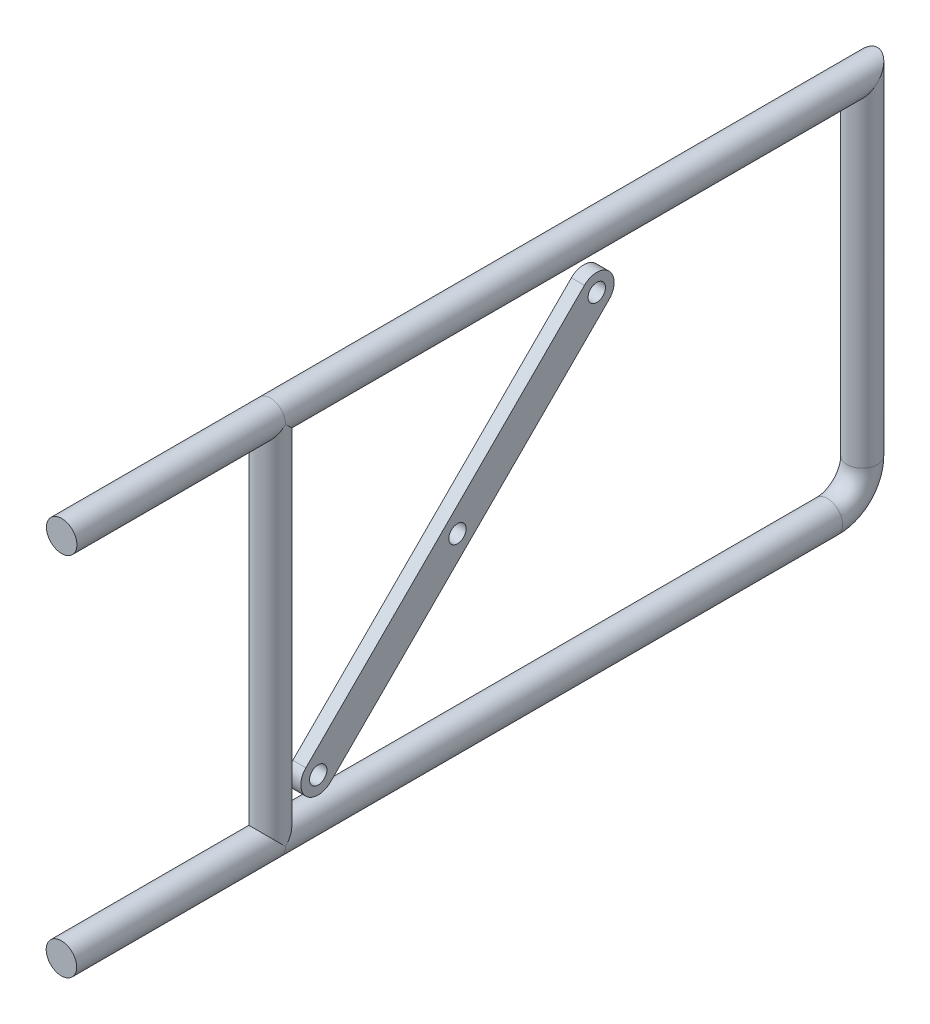
ISO-10303-21;
HEADER;
FILE_DESCRIPTION(('STEP AP214'),'2;1');
FILE_NAME('part.step','',(''),(''),'','','');
FILE_SCHEMA(('AUTOMOTIVE_DESIGN { 1 0 10303 214 1 1 1 1 }'));
ENDSEC;
DATA;
#1=APPLICATION_CONTEXT('core data for automotive mechanical design processes');
#2=APPLICATION_PROTOCOL_DEFINITION('international standard','automotive_design',2000,#1);
#3=PRODUCT_CONTEXT('',#1,'mechanical');
#4=PRODUCT('Part','Part','',(#3));
#5=PRODUCT_RELATED_PRODUCT_CATEGORY('part','',(#4));
#6=PRODUCT_DEFINITION_FORMATION('','',#4);
#7=PRODUCT_DEFINITION_CONTEXT('part definition',#1,'design');
#8=PRODUCT_DEFINITION('design','',#6,#7);
#9=PRODUCT_DEFINITION_SHAPE('','',#8);
#10=(LENGTH_UNIT() NAMED_UNIT(*) SI_UNIT(.MILLI.,.METRE.));
#11=(NAMED_UNIT(*) PLANE_ANGLE_UNIT() SI_UNIT($,.RADIAN.));
#12=(NAMED_UNIT(*) SI_UNIT($,.STERADIAN.) SOLID_ANGLE_UNIT());
#13=UNCERTAINTY_MEASURE_WITH_UNIT(LENGTH_MEASURE(1.E-05),#10,'distance_accuracy_value','');
#14=(GEOMETRIC_REPRESENTATION_CONTEXT(3) GLOBAL_UNCERTAINTY_ASSIGNED_CONTEXT((#13)) GLOBAL_UNIT_ASSIGNED_CONTEXT((#10,
#11,#12)) REPRESENTATION_CONTEXT('',''));
#15=CARTESIAN_POINT('',(0.,0.,0.));
#16=DIRECTION('',(0.,0.,1.));
#17=DIRECTION('',(1.,0.,0.));
#18=AXIS2_PLACEMENT_3D('',#15,#16,#17);
#19=CARTESIAN_POINT('',(9.525,-463.55,-380.81277953915));
#20=DIRECTION('',(1.,0.,0.));
#21=DIRECTION('',(0.,0.,-1.));
#22=AXIS2_PLACEMENT_3D('',#19,#20,#21);
#23=PLANE('',#22);
#24=CARTESIAN_POINT('',(9.525,-565.15,-279.212779539151));
#25=DIRECTION('',(1.,0.,0.));
#26=DIRECTION('',(0.,0.,-1.));
#27=AXIS2_PLACEMENT_3D('',#24,#25,#26);
#28=CIRCLE('',#27,6.34999999999999);
#29=CARTESIAN_POINT('',(9.525,-565.15,-272.86277953915));
#30=VERTEX_POINT('',#29);
#31=EDGE_CURVE('E175',#30,#30,#28,.T.);
#32=ORIENTED_EDGE('',*,*,#31,.F.);
#33=EDGE_LOOP('',(#32));
#34=FACE_BOUND('',#33,.T.);
#35=CARTESIAN_POINT('',(9.525,-463.55,-380.81277953915));
#36=DIRECTION('',(1.,0.,0.));
#37=DIRECTION('',(0.,0.,-1.));
#38=AXIS2_PLACEMENT_3D('',#35,#36,#37);
#39=CIRCLE('',#38,12.6999999999999);
#40=CARTESIAN_POINT('',(9.525,-472.530256121069,-389.793035660219));
#41=VERTEX_POINT('',#40);
#42=CARTESIAN_POINT('',(9.525,-454.569743878931,-371.832523418081));
#43=VERTEX_POINT('',#42);
#44=EDGE_CURVE('E146',#41,#43,#39,.T.);
#45=ORIENTED_EDGE('',*,*,#44,.T.);
#46=DIRECTION('',(0.,-0.707106781186549,0.707106781186546));
#47=VECTOR('',#46,1.);
#48=CARTESIAN_POINT('',(9.525,-454.569743878931,-371.832523418081));
#49=LINE('',#48,#47);
#50=CARTESIAN_POINT('',(9.525,-657.769743878931,-168.632523418082));
#51=VERTEX_POINT('',#50);
#52=EDGE_CURVE('E139',#43,#51,#49,.T.);
#53=ORIENTED_EDGE('',*,*,#52,.T.);
#54=CARTESIAN_POINT('',(9.525,-666.75,-177.612779539151));
#55=DIRECTION('',(1.,0.,0.));
#56=DIRECTION('',(0.,0.,-1.));
#57=AXIS2_PLACEMENT_3D('',#54,#55,#56);
#58=CIRCLE('',#57,12.6999999999999);
#59=CARTESIAN_POINT('',(9.525,-675.730256121069,-186.59303566022));
#60=VERTEX_POINT('',#59);
#61=EDGE_CURVE('E145',#51,#60,#58,.T.);
#62=ORIENTED_EDGE('',*,*,#61,.T.);
#63=DIRECTION('',(0.,-0.707106781186549,0.707106781186546));
#64=VECTOR('',#63,1.);
#65=CARTESIAN_POINT('',(9.525,-472.530256121069,-389.793035660219));
#66=LINE('',#65,#64);
#67=EDGE_CURVE('E155',#41,#60,#66,.T.);
#68=ORIENTED_EDGE('',*,*,#67,.F.);
#69=EDGE_LOOP('',(#45,#53,#62,#68));
#70=FACE_BOUND('',#69,.T.);
#71=CARTESIAN_POINT('',(9.525,-463.55,-380.81277953915));
#72=DIRECTION('',(1.,0.,0.));
#73=DIRECTION('',(0.,0.,-1.));
#74=AXIS2_PLACEMENT_3D('',#71,#72,#73);
#75=CIRCLE('',#74,6.34999999999999);
#76=CARTESIAN_POINT('',(9.525,-463.55,-374.46277953915));
#77=VERTEX_POINT('',#76);
#78=EDGE_CURVE('E162',#77,#77,#75,.T.);
#79=ORIENTED_EDGE('',*,*,#78,.F.);
#80=EDGE_LOOP('',(#79));
#81=FACE_BOUND('',#80,.T.);
#82=CARTESIAN_POINT('',(9.525,-666.75,-177.612779539151));
#83=DIRECTION('',(1.,0.,0.));
#84=DIRECTION('',(0.,0.,-1.));
#85=AXIS2_PLACEMENT_3D('',#82,#83,#84);
#86=CIRCLE('',#85,6.34999999999999);
#87=CARTESIAN_POINT('',(9.525,-666.75,-171.262779539151));
#88=VERTEX_POINT('',#87);
#89=EDGE_CURVE('E181',#88,#88,#86,.T.);
#90=ORIENTED_EDGE('',*,*,#89,.F.);
#91=EDGE_LOOP('',(#90));
#92=FACE_BOUND('',#91,.T.);
#93=ADVANCED_FACE('F96',(#34,#70,#81,#92),#23,.T.);
#94=CARTESIAN_POINT('',(0.,-463.55,-380.81277953915));
#95=DIRECTION('',(1.,0.,0.));
#96=DIRECTION('',(0.,0.,-1.));
#97=AXIS2_PLACEMENT_3D('',#94,#95,#96);
#98=PLANE('',#97);
#99=CARTESIAN_POINT('',(0.,-463.55,-380.81277953915));
#100=DIRECTION('',(1.,0.,0.));
#101=DIRECTION('',(0.,0.,-1.));
#102=AXIS2_PLACEMENT_3D('',#99,#100,#101);
#103=CIRCLE('',#102,12.6999999999999);
#104=CARTESIAN_POINT('',(0.,-472.530256121069,-389.793035660219));
#105=VERTEX_POINT('',#104);
#106=CARTESIAN_POINT('',(0.,-454.569743878931,-371.832523418081));
#107=VERTEX_POINT('',#106);
#108=EDGE_CURVE('E160',#105,#107,#103,.T.);
#109=ORIENTED_EDGE('',*,*,#108,.F.);
#110=DIRECTION('',(0.,-0.707106781186549,0.707106781186546));
#111=VECTOR('',#110,1.);
#112=CARTESIAN_POINT('',(0.,-472.530256121069,-389.793035660219));
#113=LINE('',#112,#111);
#114=CARTESIAN_POINT('',(0.,-675.730256121069,-186.59303566022));
#115=VERTEX_POINT('',#114);
#116=EDGE_CURVE('E166',#105,#115,#113,.T.);
#117=ORIENTED_EDGE('',*,*,#116,.T.);
#118=CARTESIAN_POINT('',(0.,-666.75,-177.612779539151));
#119=DIRECTION('',(1.,0.,0.));
#120=DIRECTION('',(0.,0.,-1.));
#121=AXIS2_PLACEMENT_3D('',#118,#119,#120);
#122=CIRCLE('',#121,12.6999999999999);
#123=CARTESIAN_POINT('',(0.,-657.769743878931,-168.632523418082));
#124=VERTEX_POINT('',#123);
#125=EDGE_CURVE('E164',#124,#115,#122,.T.);
#126=ORIENTED_EDGE('',*,*,#125,.F.);
#127=DIRECTION('',(0.,-0.707106781186549,0.707106781186546));
#128=VECTOR('',#127,1.);
#129=CARTESIAN_POINT('',(0.,-454.569743878931,-371.832523418081));
#130=LINE('',#129,#128);
#131=EDGE_CURVE('E151',#107,#124,#130,.T.);
#132=ORIENTED_EDGE('',*,*,#131,.F.);
#133=EDGE_LOOP('',(#109,#117,#126,#132));
#134=FACE_BOUND('',#133,.T.);
#135=CARTESIAN_POINT('',(0.,-463.55,-380.81277953915));
#136=DIRECTION('',(1.,0.,0.));
#137=DIRECTION('',(0.,0.,-1.));
#138=AXIS2_PLACEMENT_3D('',#135,#136,#137);
#139=CIRCLE('',#138,6.34999999999999);
#140=CARTESIAN_POINT('',(0.,-463.55,-374.46277953915));
#141=VERTEX_POINT('',#140);
#142=EDGE_CURVE('E172',#141,#141,#139,.T.);
#143=ORIENTED_EDGE('',*,*,#142,.T.);
#144=EDGE_LOOP('',(#143));
#145=FACE_BOUND('',#144,.T.);
#146=CARTESIAN_POINT('',(0.,-565.15,-279.212779539151));
#147=DIRECTION('',(1.,0.,0.));
#148=DIRECTION('',(0.,0.,-1.));
#149=AXIS2_PLACEMENT_3D('',#146,#147,#148);
#150=CIRCLE('',#149,6.34999999999999);
#151=CARTESIAN_POINT('',(0.,-565.15,-272.86277953915));
#152=VERTEX_POINT('',#151);
#153=EDGE_CURVE('E178',#152,#152,#150,.T.);
#154=ORIENTED_EDGE('',*,*,#153,.T.);
#155=EDGE_LOOP('',(#154));
#156=FACE_BOUND('',#155,.T.);
#157=CARTESIAN_POINT('',(0.,-666.75,-177.612779539151));
#158=DIRECTION('',(1.,0.,0.));
#159=DIRECTION('',(0.,0.,-1.));
#160=AXIS2_PLACEMENT_3D('',#157,#158,#159);
#161=CIRCLE('',#160,6.34999999999999);
#162=CARTESIAN_POINT('',(0.,-666.75,-171.262779539151));
#163=VERTEX_POINT('',#162);
#164=EDGE_CURVE('E184',#163,#163,#161,.T.);
#165=ORIENTED_EDGE('',*,*,#164,.T.);
#166=EDGE_LOOP('',(#165));
#167=FACE_BOUND('',#166,.T.);
#168=ADVANCED_FACE('F194',(#134,#145,#156,#167),#98,.F.);
#169=CARTESIAN_POINT('',(9.525,-463.55,-380.81277953915));
#170=DIRECTION('',(-1.,0.,0.));
#171=DIRECTION('',(0.,0.,1.));
#172=AXIS2_PLACEMENT_3D('',#169,#170,#171);
#173=CYLINDRICAL_SURFACE('',#172,12.6999999999999);
#174=ORIENTED_EDGE('',*,*,#108,.T.);
#175=DIRECTION('',(-1.,0.,0.));
#176=VECTOR('',#175,1.);
#177=CARTESIAN_POINT('',(9.525,-454.569743878931,-371.832523418081));
#178=LINE('',#177,#176);
#179=EDGE_CURVE('E13',#43,#107,#178,.T.);
#180=ORIENTED_EDGE('',*,*,#179,.F.);
#181=ORIENTED_EDGE('',*,*,#44,.F.);
#182=DIRECTION('',(-1.,0.,0.));
#183=VECTOR('',#182,1.);
#184=CARTESIAN_POINT('',(9.525,-472.530256121069,-389.793035660219));
#185=LINE('',#184,#183);
#186=EDGE_CURVE('E113',#41,#105,#185,.T.);
#187=ORIENTED_EDGE('',*,*,#186,.T.);
#188=EDGE_LOOP('',(#174,#180,#181,#187));
#189=FACE_BOUND('',#188,.T.);
#190=ADVANCED_FACE('F98',(#189),#173,.T.);
#191=CARTESIAN_POINT('',(9.525,-454.569743878931,-371.832523418081));
#192=DIRECTION('',(0.,-0.707106781186546,-0.707106781186549));
#193=DIRECTION('',(0.,0.707106781186549,-0.707106781186546));
#194=AXIS2_PLACEMENT_3D('',#191,#192,#193);
#195=PLANE('',#194);
#196=ORIENTED_EDGE('',*,*,#131,.T.);
#197=DIRECTION('',(-1.,0.,0.));
#198=VECTOR('',#197,1.);
#199=CARTESIAN_POINT('',(9.525,-657.769743878931,-168.632523418082));
#200=LINE('',#199,#198);
#201=EDGE_CURVE('E105',#51,#124,#200,.T.);
#202=ORIENTED_EDGE('',*,*,#201,.F.);
#203=ORIENTED_EDGE('',*,*,#52,.F.);
#204=ORIENTED_EDGE('',*,*,#179,.T.);
#205=EDGE_LOOP('',(#196,#202,#203,#204));
#206=FACE_BOUND('',#205,.T.);
#207=ADVANCED_FACE('F150',(#206),#195,.F.);
#208=CARTESIAN_POINT('',(9.525,-666.75,-177.612779539151));
#209=DIRECTION('',(-1.,0.,0.));
#210=DIRECTION('',(0.,0.,1.));
#211=AXIS2_PLACEMENT_3D('',#208,#209,#210);
#212=CYLINDRICAL_SURFACE('',#211,12.6999999999999);
#213=ORIENTED_EDGE('',*,*,#125,.T.);
#214=DIRECTION('',(-1.,0.,0.));
#215=VECTOR('',#214,1.);
#216=CARTESIAN_POINT('',(9.525,-675.730256121069,-186.59303566022));
#217=LINE('',#216,#215);
#218=EDGE_CURVE('E128',#60,#115,#217,.T.);
#219=ORIENTED_EDGE('',*,*,#218,.F.);
#220=ORIENTED_EDGE('',*,*,#61,.F.);
#221=ORIENTED_EDGE('',*,*,#201,.T.);
#222=EDGE_LOOP('',(#213,#219,#220,#221));
#223=FACE_BOUND('',#222,.T.);
#224=ADVANCED_FACE('F154',(#223),#212,.T.);
#225=CARTESIAN_POINT('',(9.525,-472.530256121069,-389.793035660219));
#226=DIRECTION('',(0.,-0.707106781186546,-0.707106781186549));
#227=DIRECTION('',(0.,0.707106781186549,-0.707106781186546));
#228=AXIS2_PLACEMENT_3D('',#225,#226,#227);
#229=PLANE('',#228);
#230=ORIENTED_EDGE('',*,*,#116,.F.);
#231=ORIENTED_EDGE('',*,*,#186,.F.);
#232=ORIENTED_EDGE('',*,*,#67,.T.);
#233=ORIENTED_EDGE('',*,*,#218,.T.);
#234=EDGE_LOOP('',(#230,#231,#232,#233));
#235=FACE_BOUND('',#234,.T.);
#236=ADVANCED_FACE('F206',(#235),#229,.T.);
#237=CARTESIAN_POINT('',(9.525,-463.55,-380.81277953915));
#238=DIRECTION('',(-1.,0.,0.));
#239=DIRECTION('',(0.,0.,1.));
#240=AXIS2_PLACEMENT_3D('',#237,#238,#239);
#241=CYLINDRICAL_SURFACE('',#240,6.34999999999999);
#242=CARTESIAN_POINT('',(9.525,-463.55,-374.46277953915));
#243=CARTESIAN_POINT('',(9.42578125,-463.55,-374.46277953915));
#244=CARTESIAN_POINT('',(9.3265625,-463.55,-374.46277953915));
#245=CARTESIAN_POINT('',(9.128125,-463.55,-374.46277953915));
#246=CARTESIAN_POINT('',(9.02890625,-463.55,-374.46277953915));
#247=CARTESIAN_POINT('',(8.83046875,-463.55,-374.46277953915));
#248=CARTESIAN_POINT('',(8.73125,-463.55,-374.46277953915));
#249=CARTESIAN_POINT('',(8.5328125,-463.55,-374.46277953915));
#250=CARTESIAN_POINT('',(8.43359375,-463.55,-374.46277953915));
#251=CARTESIAN_POINT('',(8.23515625,-463.55,-374.46277953915));
#252=CARTESIAN_POINT('',(8.1359375,-463.55,-374.46277953915));
#253=CARTESIAN_POINT('',(7.9375,-463.55,-374.46277953915));
#254=CARTESIAN_POINT('',(7.83828125,-463.55,-374.46277953915));
#255=CARTESIAN_POINT('',(7.63984375,-463.55,-374.46277953915));
#256=CARTESIAN_POINT('',(7.540625,-463.55,-374.46277953915));
#257=CARTESIAN_POINT('',(7.3421875,-463.55,-374.46277953915));
#258=CARTESIAN_POINT('',(7.24296875,-463.55,-374.46277953915));
#259=CARTESIAN_POINT('',(7.04453125,-463.55,-374.46277953915));
#260=CARTESIAN_POINT('',(6.9453125,-463.55,-374.46277953915));
#261=CARTESIAN_POINT('',(6.746875,-463.55,-374.46277953915));
#262=CARTESIAN_POINT('',(6.64765625,-463.55,-374.46277953915));
#263=CARTESIAN_POINT('',(6.44921875,-463.55,-374.46277953915));
#264=CARTESIAN_POINT('',(6.35,-463.55,-374.46277953915));
#265=CARTESIAN_POINT('',(6.1515625,-463.55,-374.46277953915));
#266=CARTESIAN_POINT('',(6.05234375,-463.55,-374.46277953915));
#267=CARTESIAN_POINT('',(5.85390625,-463.55,-374.46277953915));
#268=CARTESIAN_POINT('',(5.7546875,-463.55,-374.46277953915));
#269=CARTESIAN_POINT('',(5.55625,-463.55,-374.46277953915));
#270=CARTESIAN_POINT('',(5.45703125,-463.55,-374.46277953915));
#271=CARTESIAN_POINT('',(5.25859375,-463.55,-374.46277953915));
#272=CARTESIAN_POINT('',(5.159375,-463.55,-374.46277953915));
#273=CARTESIAN_POINT('',(4.9609375,-463.55,-374.46277953915));
#274=CARTESIAN_POINT('',(4.86171875,-463.55,-374.46277953915));
#275=CARTESIAN_POINT('',(4.66328125,-463.55,-374.46277953915));
#276=CARTESIAN_POINT('',(4.5640625,-463.55,-374.46277953915));
#277=CARTESIAN_POINT('',(4.365625,-463.55,-374.46277953915));
#278=CARTESIAN_POINT('',(4.26640625,-463.55,-374.46277953915));
#279=CARTESIAN_POINT('',(4.06796875,-463.55,-374.46277953915));
#280=CARTESIAN_POINT('',(3.96875,-463.55,-374.46277953915));
#281=CARTESIAN_POINT('',(3.7703125,-463.55,-374.46277953915));
#282=CARTESIAN_POINT('',(3.67109375,-463.55,-374.46277953915));
#283=CARTESIAN_POINT('',(3.47265625,-463.55,-374.46277953915));
#284=CARTESIAN_POINT('',(3.3734375,-463.55,-374.46277953915));
#285=CARTESIAN_POINT('',(3.175,-463.55,-374.46277953915));
#286=CARTESIAN_POINT('',(3.07578125,-463.55,-374.46277953915));
#287=CARTESIAN_POINT('',(2.87734375,-463.55,-374.46277953915));
#288=CARTESIAN_POINT('',(2.778125,-463.55,-374.46277953915));
#289=CARTESIAN_POINT('',(2.5796875,-463.55,-374.46277953915));
#290=CARTESIAN_POINT('',(2.48046875,-463.55,-374.46277953915));
#291=CARTESIAN_POINT('',(2.28203125,-463.55,-374.46277953915));
#292=CARTESIAN_POINT('',(2.1828125,-463.55,-374.46277953915));
#293=CARTESIAN_POINT('',(1.984375,-463.55,-374.46277953915));
#294=CARTESIAN_POINT('',(1.88515625,-463.55,-374.46277953915));
#295=CARTESIAN_POINT('',(1.68671875,-463.55,-374.46277953915));
#296=CARTESIAN_POINT('',(1.5875,-463.55,-374.46277953915));
#297=CARTESIAN_POINT('',(1.3890625,-463.55,-374.46277953915));
#298=CARTESIAN_POINT('',(1.28984375,-463.55,-374.46277953915));
#299=CARTESIAN_POINT('',(1.09140625,-463.55,-374.46277953915));
#300=CARTESIAN_POINT('',(0.992187500000001,-463.55,-374.46277953915));
#301=CARTESIAN_POINT('',(0.793750000000001,-463.55,-374.46277953915));
#302=CARTESIAN_POINT('',(0.69453125,-463.55,-374.46277953915));
#303=CARTESIAN_POINT('',(0.49609375,-463.55,-374.46277953915));
#304=CARTESIAN_POINT('',(0.396875,-463.55,-374.46277953915));
#305=CARTESIAN_POINT('',(0.1984375,-463.55,-374.46277953915));
#306=CARTESIAN_POINT('',(0.0992187500000001,-463.55,-374.46277953915));
#307=CARTESIAN_POINT('',(0.,-463.55,-374.46277953915));
#308=B_SPLINE_CURVE_WITH_KNOTS('',3,(#242,#243,#244,#245,#246,#247,#248,#249,#250,#251,#252,
#253,#254,#255,#256,#257,#258,#259,#260,#261,#262,#263,#264,#265,#266,#267,#268,#269,#270,#271,
#272,#273,#274,#275,#276,#277,#278,#279,#280,#281,#282,#283,#284,#285,#286,#287,#288,#289,#290,
#291,#292,#293,#294,#295,#296,#297,#298,#299,#300,#301,#302,#303,#304,#305,#306,#307),
.UNSPECIFIED.,.F.,.F.,(4,2,2,2,2,2,2,2,2,2,2,2,2,2,2,2,2,2,2,2,2,2,2,2,2,2,2,2,2,2,2,2,4),(0.,
0.297656249999998,0.595312499999999,0.892968749999999,1.190625,1.48828125,1.7859375,2.08359375,
2.38125,2.67890625,2.9765625,3.27421875,3.571875,3.86953125,4.1671875,4.46484375,4.7625,
5.06015625,5.3578125,5.65546875,5.953125,6.25078125,6.5484375,6.84609375,7.14375,7.44140625,
7.7390625,8.03671875,8.334375,8.63203125,8.9296875,9.22734375,9.525),.UNSPECIFIED.);
#309=EDGE_CURVE('BSEAM203',#77,#141,#308,.T.);
#310=ORIENTED_EDGE('',*,*,#78,.T.);
#311=ORIENTED_EDGE('',*,*,#142,.F.);
#312=ORIENTED_EDGE('',*,*,#309,.T.);
#313=ORIENTED_EDGE('',*,*,#309,.F.);
#314=EDGE_LOOP('',(#310,#312,#311,#313));
#315=FACE_BOUND('',#314,.T.);
#316=ADVANCED_FACE('F203',(#315),#241,.F.);
#317=CARTESIAN_POINT('',(9.525,-565.15,-279.212779539151));
#318=DIRECTION('',(-1.,0.,0.));
#319=DIRECTION('',(0.,0.,1.));
#320=AXIS2_PLACEMENT_3D('',#317,#318,#319);
#321=CYLINDRICAL_SURFACE('',#320,6.34999999999999);
#322=CARTESIAN_POINT('',(9.525,-565.15,-272.86277953915));
#323=CARTESIAN_POINT('',(9.42578125,-565.15,-272.86277953915));
#324=CARTESIAN_POINT('',(9.3265625,-565.15,-272.86277953915));
#325=CARTESIAN_POINT('',(9.128125,-565.15,-272.86277953915));
#326=CARTESIAN_POINT('',(9.02890625,-565.15,-272.86277953915));
#327=CARTESIAN_POINT('',(8.83046875,-565.15,-272.86277953915));
#328=CARTESIAN_POINT('',(8.73125,-565.15,-272.86277953915));
#329=CARTESIAN_POINT('',(8.5328125,-565.15,-272.86277953915));
#330=CARTESIAN_POINT('',(8.43359375,-565.15,-272.86277953915));
#331=CARTESIAN_POINT('',(8.23515625,-565.15,-272.86277953915));
#332=CARTESIAN_POINT('',(8.1359375,-565.15,-272.86277953915));
#333=CARTESIAN_POINT('',(7.9375,-565.15,-272.86277953915));
#334=CARTESIAN_POINT('',(7.83828125,-565.15,-272.86277953915));
#335=CARTESIAN_POINT('',(7.63984375,-565.15,-272.86277953915));
#336=CARTESIAN_POINT('',(7.540625,-565.15,-272.86277953915));
#337=CARTESIAN_POINT('',(7.3421875,-565.15,-272.86277953915));
#338=CARTESIAN_POINT('',(7.24296875,-565.15,-272.86277953915));
#339=CARTESIAN_POINT('',(7.04453125,-565.15,-272.86277953915));
#340=CARTESIAN_POINT('',(6.9453125,-565.15,-272.86277953915));
#341=CARTESIAN_POINT('',(6.746875,-565.15,-272.86277953915));
#342=CARTESIAN_POINT('',(6.64765625,-565.15,-272.86277953915));
#343=CARTESIAN_POINT('',(6.44921875,-565.15,-272.86277953915));
#344=CARTESIAN_POINT('',(6.35,-565.15,-272.86277953915));
#345=CARTESIAN_POINT('',(6.1515625,-565.15,-272.86277953915));
#346=CARTESIAN_POINT('',(6.05234375,-565.15,-272.86277953915));
#347=CARTESIAN_POINT('',(5.85390625,-565.15,-272.86277953915));
#348=CARTESIAN_POINT('',(5.7546875,-565.15,-272.86277953915));
#349=CARTESIAN_POINT('',(5.55625,-565.15,-272.86277953915));
#350=CARTESIAN_POINT('',(5.45703125,-565.15,-272.86277953915));
#351=CARTESIAN_POINT('',(5.25859375,-565.15,-272.86277953915));
#352=CARTESIAN_POINT('',(5.159375,-565.15,-272.86277953915));
#353=CARTESIAN_POINT('',(4.9609375,-565.15,-272.86277953915));
#354=CARTESIAN_POINT('',(4.86171875,-565.15,-272.86277953915));
#355=CARTESIAN_POINT('',(4.66328125,-565.15,-272.86277953915));
#356=CARTESIAN_POINT('',(4.5640625,-565.15,-272.86277953915));
#357=CARTESIAN_POINT('',(4.365625,-565.15,-272.86277953915));
#358=CARTESIAN_POINT('',(4.26640625,-565.15,-272.86277953915));
#359=CARTESIAN_POINT('',(4.06796875,-565.15,-272.86277953915));
#360=CARTESIAN_POINT('',(3.96875,-565.15,-272.86277953915));
#361=CARTESIAN_POINT('',(3.7703125,-565.15,-272.86277953915));
#362=CARTESIAN_POINT('',(3.67109375,-565.15,-272.86277953915));
#363=CARTESIAN_POINT('',(3.47265625,-565.15,-272.86277953915));
#364=CARTESIAN_POINT('',(3.3734375,-565.15,-272.86277953915));
#365=CARTESIAN_POINT('',(3.175,-565.15,-272.86277953915));
#366=CARTESIAN_POINT('',(3.07578125,-565.15,-272.86277953915));
#367=CARTESIAN_POINT('',(2.87734375,-565.15,-272.86277953915));
#368=CARTESIAN_POINT('',(2.778125,-565.15,-272.86277953915));
#369=CARTESIAN_POINT('',(2.5796875,-565.15,-272.86277953915));
#370=CARTESIAN_POINT('',(2.48046875,-565.15,-272.86277953915));
#371=CARTESIAN_POINT('',(2.28203125,-565.15,-272.86277953915));
#372=CARTESIAN_POINT('',(2.1828125,-565.15,-272.86277953915));
#373=CARTESIAN_POINT('',(1.984375,-565.15,-272.86277953915));
#374=CARTESIAN_POINT('',(1.88515625,-565.15,-272.86277953915));
#375=CARTESIAN_POINT('',(1.68671875,-565.15,-272.86277953915));
#376=CARTESIAN_POINT('',(1.5875,-565.15,-272.86277953915));
#377=CARTESIAN_POINT('',(1.3890625,-565.15,-272.86277953915));
#378=CARTESIAN_POINT('',(1.28984375,-565.15,-272.86277953915));
#379=CARTESIAN_POINT('',(1.09140625,-565.15,-272.86277953915));
#380=CARTESIAN_POINT('',(0.992187500000001,-565.15,-272.86277953915));
#381=CARTESIAN_POINT('',(0.793750000000001,-565.15,-272.86277953915));
#382=CARTESIAN_POINT('',(0.69453125,-565.15,-272.86277953915));
#383=CARTESIAN_POINT('',(0.49609375,-565.15,-272.86277953915));
#384=CARTESIAN_POINT('',(0.396875,-565.15,-272.86277953915));
#385=CARTESIAN_POINT('',(0.1984375,-565.15,-272.86277953915));
#386=CARTESIAN_POINT('',(0.0992187500000001,-565.15,-272.86277953915));
#387=CARTESIAN_POINT('',(0.,-565.15,-272.86277953915));
#388=B_SPLINE_CURVE_WITH_KNOTS('',3,(#322,#323,#324,#325,#326,#327,#328,#329,#330,#331,#332,
#333,#334,#335,#336,#337,#338,#339,#340,#341,#342,#343,#344,#345,#346,#347,#348,#349,#350,#351,
#352,#353,#354,#355,#356,#357,#358,#359,#360,#361,#362,#363,#364,#365,#366,#367,#368,#369,#370,
#371,#372,#373,#374,#375,#376,#377,#378,#379,#380,#381,#382,#383,#384,#385,#386,#387),
.UNSPECIFIED.,.F.,.F.,(4,2,2,2,2,2,2,2,2,2,2,2,2,2,2,2,2,2,2,2,2,2,2,2,2,2,2,2,2,2,2,2,4),(0.,
0.297656249999998,0.595312499999999,0.892968749999999,1.190625,1.48828125,1.7859375,2.08359375,
2.38125,2.67890625,2.9765625,3.27421875,3.571875,3.86953125,4.1671875,4.46484375,4.7625,
5.06015625,5.3578125,5.65546875,5.953125,6.25078125,6.5484375,6.84609375,7.14375,7.44140625,
7.7390625,8.03671875,8.334375,8.63203125,8.9296875,9.22734375,9.525),.UNSPECIFIED.);
#389=EDGE_CURVE('BSEAM223',#30,#152,#388,.T.);
#390=ORIENTED_EDGE('',*,*,#31,.T.);
#391=ORIENTED_EDGE('',*,*,#153,.F.);
#392=ORIENTED_EDGE('',*,*,#389,.T.);
#393=ORIENTED_EDGE('',*,*,#389,.F.);
#394=EDGE_LOOP('',(#390,#392,#391,#393));
#395=FACE_BOUND('',#394,.T.);
#396=ADVANCED_FACE('F223',(#395),#321,.F.);
#397=CARTESIAN_POINT('',(9.525,-666.75,-177.612779539151));
#398=DIRECTION('',(-1.,0.,0.));
#399=DIRECTION('',(0.,0.,1.));
#400=AXIS2_PLACEMENT_3D('',#397,#398,#399);
#401=CYLINDRICAL_SURFACE('',#400,6.34999999999999);
#402=CARTESIAN_POINT('',(9.525,-666.75,-171.262779539151));
#403=CARTESIAN_POINT('',(9.42578125,-666.75,-171.262779539151));
#404=CARTESIAN_POINT('',(9.3265625,-666.75,-171.262779539151));
#405=CARTESIAN_POINT('',(9.128125,-666.75,-171.262779539151));
#406=CARTESIAN_POINT('',(9.02890625,-666.75,-171.262779539151));
#407=CARTESIAN_POINT('',(8.83046875,-666.75,-171.262779539151));
#408=CARTESIAN_POINT('',(8.73125,-666.75,-171.262779539151));
#409=CARTESIAN_POINT('',(8.5328125,-666.75,-171.262779539151));
#410=CARTESIAN_POINT('',(8.43359375,-666.75,-171.262779539151));
#411=CARTESIAN_POINT('',(8.23515625,-666.75,-171.262779539151));
#412=CARTESIAN_POINT('',(8.1359375,-666.75,-171.262779539151));
#413=CARTESIAN_POINT('',(7.9375,-666.75,-171.262779539151));
#414=CARTESIAN_POINT('',(7.83828125,-666.75,-171.262779539151));
#415=CARTESIAN_POINT('',(7.63984375,-666.75,-171.262779539151));
#416=CARTESIAN_POINT('',(7.540625,-666.75,-171.262779539151));
#417=CARTESIAN_POINT('',(7.3421875,-666.75,-171.262779539151));
#418=CARTESIAN_POINT('',(7.24296875,-666.75,-171.262779539151));
#419=CARTESIAN_POINT('',(7.04453125,-666.75,-171.262779539151));
#420=CARTESIAN_POINT('',(6.9453125,-666.75,-171.262779539151));
#421=CARTESIAN_POINT('',(6.746875,-666.75,-171.262779539151));
#422=CARTESIAN_POINT('',(6.64765625,-666.75,-171.262779539151));
#423=CARTESIAN_POINT('',(6.44921875,-666.75,-171.262779539151));
#424=CARTESIAN_POINT('',(6.35,-666.75,-171.262779539151));
#425=CARTESIAN_POINT('',(6.1515625,-666.75,-171.262779539151));
#426=CARTESIAN_POINT('',(6.05234375,-666.75,-171.262779539151));
#427=CARTESIAN_POINT('',(5.85390625,-666.75,-171.262779539151));
#428=CARTESIAN_POINT('',(5.7546875,-666.75,-171.262779539151));
#429=CARTESIAN_POINT('',(5.55625,-666.75,-171.262779539151));
#430=CARTESIAN_POINT('',(5.45703125,-666.75,-171.262779539151));
#431=CARTESIAN_POINT('',(5.25859375,-666.75,-171.262779539151));
#432=CARTESIAN_POINT('',(5.159375,-666.75,-171.262779539151));
#433=CARTESIAN_POINT('',(4.9609375,-666.75,-171.262779539151));
#434=CARTESIAN_POINT('',(4.86171875,-666.75,-171.262779539151));
#435=CARTESIAN_POINT('',(4.66328125,-666.75,-171.262779539151));
#436=CARTESIAN_POINT('',(4.5640625,-666.75,-171.262779539151));
#437=CARTESIAN_POINT('',(4.365625,-666.75,-171.262779539151));
#438=CARTESIAN_POINT('',(4.26640625,-666.75,-171.262779539151));
#439=CARTESIAN_POINT('',(4.06796875,-666.75,-171.262779539151));
#440=CARTESIAN_POINT('',(3.96875,-666.75,-171.262779539151));
#441=CARTESIAN_POINT('',(3.7703125,-666.75,-171.262779539151));
#442=CARTESIAN_POINT('',(3.67109375,-666.75,-171.262779539151));
#443=CARTESIAN_POINT('',(3.47265625,-666.75,-171.262779539151));
#444=CARTESIAN_POINT('',(3.3734375,-666.75,-171.262779539151));
#445=CARTESIAN_POINT('',(3.175,-666.75,-171.262779539151));
#446=CARTESIAN_POINT('',(3.07578125,-666.75,-171.262779539151));
#447=CARTESIAN_POINT('',(2.87734375,-666.75,-171.262779539151));
#448=CARTESIAN_POINT('',(2.778125,-666.75,-171.262779539151));
#449=CARTESIAN_POINT('',(2.5796875,-666.75,-171.262779539151));
#450=CARTESIAN_POINT('',(2.48046875,-666.75,-171.262779539151));
#451=CARTESIAN_POINT('',(2.28203125,-666.75,-171.262779539151));
#452=CARTESIAN_POINT('',(2.1828125,-666.75,-171.262779539151));
#453=CARTESIAN_POINT('',(1.984375,-666.75,-171.262779539151));
#454=CARTESIAN_POINT('',(1.88515625,-666.75,-171.262779539151));
#455=CARTESIAN_POINT('',(1.68671875,-666.75,-171.262779539151));
#456=CARTESIAN_POINT('',(1.5875,-666.75,-171.262779539151));
#457=CARTESIAN_POINT('',(1.3890625,-666.75,-171.262779539151));
#458=CARTESIAN_POINT('',(1.28984375,-666.75,-171.262779539151));
#459=CARTESIAN_POINT('',(1.09140625,-666.75,-171.262779539151));
#460=CARTESIAN_POINT('',(0.992187500000001,-666.75,-171.262779539151));
#461=CARTESIAN_POINT('',(0.793750000000001,-666.75,-171.262779539151));
#462=CARTESIAN_POINT('',(0.69453125,-666.75,-171.262779539151));
#463=CARTESIAN_POINT('',(0.49609375,-666.75,-171.262779539151));
#464=CARTESIAN_POINT('',(0.396875,-666.75,-171.262779539151));
#465=CARTESIAN_POINT('',(0.1984375,-666.75,-171.262779539151));
#466=CARTESIAN_POINT('',(0.0992187500000001,-666.75,-171.262779539151));
#467=CARTESIAN_POINT('',(0.,-666.75,-171.262779539151));
#468=B_SPLINE_CURVE_WITH_KNOTS('',3,(#402,#403,#404,#405,#406,#407,#408,#409,#410,#411,#412,
#413,#414,#415,#416,#417,#418,#419,#420,#421,#422,#423,#424,#425,#426,#427,#428,#429,#430,#431,
#432,#433,#434,#435,#436,#437,#438,#439,#440,#441,#442,#443,#444,#445,#446,#447,#448,#449,#450,
#451,#452,#453,#454,#455,#456,#457,#458,#459,#460,#461,#462,#463,#464,#465,#466,#467),
.UNSPECIFIED.,.F.,.F.,(4,2,2,2,2,2,2,2,2,2,2,2,2,2,2,2,2,2,2,2,2,2,2,2,2,2,2,2,2,2,2,2,4),(0.,
0.297656249999998,0.595312499999999,0.892968749999999,1.190625,1.48828125,1.7859375,2.08359375,
2.38125,2.67890625,2.9765625,3.27421875,3.571875,3.86953125,4.1671875,4.46484375,4.7625,
5.06015625,5.3578125,5.65546875,5.953125,6.25078125,6.5484375,6.84609375,7.14375,7.44140625,
7.7390625,8.03671875,8.334375,8.63203125,8.9296875,9.22734375,9.525),.UNSPECIFIED.);
#469=EDGE_CURVE('BSEAM190',#88,#163,#468,.T.);
#470=ORIENTED_EDGE('',*,*,#89,.T.);
#471=ORIENTED_EDGE('',*,*,#164,.F.);
#472=ORIENTED_EDGE('',*,*,#469,.T.);
#473=ORIENTED_EDGE('',*,*,#469,.F.);
#474=EDGE_LOOP('',(#470,#472,#471,#473));
#475=FACE_BOUND('',#474,.T.);
#476=ADVANCED_FACE('F190',(#475),#401,.F.);
#477=CLOSED_SHELL('',(#93,#168,#190,#207,#224,#236,#316,#396,#476));
#478=MANIFOLD_SOLID_BREP('B2',#477);
#479=CARTESIAN_POINT('',(0.,-698.5,0.18722046084918));
#480=DIRECTION('',(0.,0.,1.));
#481=DIRECTION('',(1.,0.,0.));
#482=AXIS2_PLACEMENT_3D('',#479,#480,#481);
#483=PLANE('',#482);
#484=CARTESIAN_POINT('',(0.,-698.5,0.18722046084918));
#485=DIRECTION('',(0.,0.,1.));
#486=DIRECTION('',(1.,0.,0.));
#487=AXIS2_PLACEMENT_3D('',#484,#485,#486);
#488=CIRCLE('',#487,11.1125);
#489=CARTESIAN_POINT('',(11.1125,-698.5,0.18722046084918));
#490=VERTEX_POINT('',#489);
#491=EDGE_CURVE('E339',#490,#490,#488,.T.);
#492=ORIENTED_EDGE('',*,*,#491,.T.);
#493=EDGE_LOOP('',(#492));
#494=FACE_BOUND('',#493,.T.);
#495=ADVANCED_FACE('F288',(#494),#483,.T.);
#496=CARTESIAN_POINT('',(0.,-431.8,0.));
#497=DIRECTION('',(0.,0.,-1.));
#498=DIRECTION('',(1.,0.,0.));
#499=AXIS2_PLACEMENT_3D('',#496,#497,#498);
#500=PLANE('',#499);
#501=CARTESIAN_POINT('',(0.,-431.8,0.));
#502=DIRECTION('',(0.,0.,-1.));
#503=DIRECTION('',(1.,0.,0.));
#504=AXIS2_PLACEMENT_3D('',#501,#502,#503);
#505=CIRCLE('',#504,11.1125);
#506=CARTESIAN_POINT('',(11.1125,-431.8,0.));
#507=VERTEX_POINT('',#506);
#508=EDGE_CURVE('E295',#507,#507,#505,.T.);
#509=ORIENTED_EDGE('',*,*,#508,.F.);
#510=EDGE_LOOP('',(#509));
#511=FACE_BOUND('',#510,.T.);
#512=ADVANCED_FACE('F359',(#511),#500,.F.);
#513=CARTESIAN_POINT('',(0.,-407.2525,-584.012779539151));
#514=DIRECTION('',(0.,-1.,0.));
#515=DIRECTION('',(0.,0.,-1.));
#516=AXIS2_PLACEMENT_3D('',#513,#514,#515);
#517=CYLINDRICAL_SURFACE('',#516,11.1125);
#518=CARTESIAN_POINT('',(0.,-431.8,-584.012779539151));
#519=DIRECTION('',(0.,-0.707106781186548,-0.707106781186548));
#520=DIRECTION('',(0.,0.707106781186548,-0.707106781186548));
#521=AXIS2_PLACEMENT_3D('',#518,#519,#520);
#522=ELLIPSE('',#521,15.715448211871,11.1125);
#523=CARTESIAN_POINT('',(0.,-420.6875,-595.125279539151));
#524=VERTEX_POINT('',#523);
#525=EDGE_CURVE('E323',#524,#524,#522,.F.);
#526=ORIENTED_EDGE('',*,*,#525,.F.);
#527=EDGE_LOOP('',(#526));
#528=FACE_BOUND('',#527,.T.);
#529=CARTESIAN_POINT('',(0.,-673.1,-584.012779539151));
#530=DIRECTION('',(0.,-1.,0.));
#531=DIRECTION('',(1.,0.,0.));
#532=AXIS2_PLACEMENT_3D('',#529,#530,#531);
#533=CIRCLE('',#532,11.1125);
#534=CARTESIAN_POINT('',(0.,-673.1,-595.125279539151));
#535=VERTEX_POINT('',#534);
#536=EDGE_CURVE('E345',#535,#535,#533,.T.);
#537=ORIENTED_EDGE('',*,*,#536,.F.);
#538=EDGE_LOOP('',(#537));
#539=FACE_BOUND('',#538,.T.);
#540=ADVANCED_FACE('F357',(#528,#539),#517,.T.);
#541=CARTESIAN_POINT('',(0.,-673.1,-558.612779539151));
#542=DIRECTION('',(-1.,0.,0.));
#543=DIRECTION('',(0.,0.,1.));
#544=AXIS2_PLACEMENT_3D('',#541,#542,#543);
#545=TOROIDAL_SURFACE('',#544,25.4,11.1125);
#546=CARTESIAN_POINT('',(0.,-698.5,-558.612779539157));
#547=DIRECTION('',(0.,0.,1.));
#548=DIRECTION('',(1.,0.,0.));
#549=AXIS2_PLACEMENT_3D('',#546,#547,#548);
#550=CIRCLE('',#549,11.1125);
#551=CARTESIAN_POINT('',(0.,-709.6125,-558.612779539159));
#552=VERTEX_POINT('',#551);
#553=EDGE_CURVE('E350',#552,#552,#550,.T.);
#554=CARTESIAN_POINT('',(0.,-673.1,-558.612779539151));
#555=DIRECTION('',(-1.,0.,0.));
#556=DIRECTION('',(0.,0.,1.));
#557=AXIS2_PLACEMENT_3D('',#554,#555,#556);
#558=CIRCLE('',#557,36.5125);
#559=EDGE_CURVE('',#535,#552,#558,.T.);
#560=ORIENTED_EDGE('',*,*,#536,.T.);
#561=ORIENTED_EDGE('',*,*,#553,.F.);
#562=ORIENTED_EDGE('',*,*,#559,.T.);
#563=ORIENTED_EDGE('',*,*,#559,.F.);
#564=EDGE_LOOP('',(#560,#562,#561,#563));
#565=FACE_BOUND('',#564,.T.);
#566=ADVANCED_FACE('F355',(#565),#545,.T.);
#567=CARTESIAN_POINT('',(0.,-698.5,-558.612779539151));
#568=DIRECTION('',(0.,0.,1.));
#569=DIRECTION('',(1.,0.,0.));
#570=AXIS2_PLACEMENT_3D('',#567,#568,#569);
#571=CYLINDRICAL_SURFACE('',#570,11.1125);
#572=CARTESIAN_POINT('',(0.,-698.5,-152.212779539151));
#573=DIRECTION('',(0.,0.,1.));
#574=DIRECTION('',(1.,0.,0.));
#575=AXIS2_PLACEMENT_3D('',#572,#573,#574);
#576=CIRCLE('',#575,11.1125);
#577=CARTESIAN_POINT('',(-11.1125,-698.5,-152.212779539151));
#578=VERTEX_POINT('',#577);
#579=CARTESIAN_POINT('',(11.1125,-698.5,-152.212779539151));
#580=VERTEX_POINT('',#579);
#581=EDGE_CURVE('E348',#578,#580,#576,.T.);
#582=ORIENTED_EDGE('',*,*,#581,.F.);
#583=CARTESIAN_POINT('',(0.,-698.5,-152.212779539151));
#584=DIRECTION('',(0.,0.707106781186547,0.707106781186547));
#585=DIRECTION('',(0.,-0.707106781186548,0.707106781186547));
#586=AXIS2_PLACEMENT_3D('',#583,#584,#585);
#587=ELLIPSE('',#586,15.715448211871,11.1125);
#588=EDGE_CURVE('E329',#580,#578,#587,.T.);
#589=ORIENTED_EDGE('',*,*,#588,.F.);
#590=EDGE_LOOP('',(#582,#589));
#591=FACE_BOUND('',#590,.T.);
#592=ORIENTED_EDGE('',*,*,#553,.T.);
#593=EDGE_LOOP('',(#592));
#594=FACE_BOUND('',#593,.T.);
#595=ADVANCED_FACE('F366',(#591,#594),#571,.T.);
#596=CARTESIAN_POINT('',(0.,-698.5,-152.212779539151));
#597=DIRECTION('',(0.,0.,1.));
#598=DIRECTION('',(1.,0.,0.));
#599=AXIS2_PLACEMENT_3D('',#596,#597,#598);
#600=CYLINDRICAL_SURFACE('',#599,11.1125);
#601=CARTESIAN_POINT('',(0.,-698.5,-152.212779539151));
#602=DIRECTION('',(0.,-0.707106781186548,0.707106781186547));
#603=DIRECTION('',(0.,-0.707106781186547,-0.707106781186548));
#604=AXIS2_PLACEMENT_3D('',#601,#602,#603);
#605=ELLIPSE('',#604,15.715448211871,11.1125);
#606=EDGE_CURVE('E301',#578,#580,#605,.F.);
#607=ORIENTED_EDGE('',*,*,#606,.F.);
#608=ORIENTED_EDGE('',*,*,#581,.T.);
#609=EDGE_LOOP('',(#607,#608));
#610=FACE_BOUND('',#609,.T.);
#611=ORIENTED_EDGE('',*,*,#491,.F.);
#612=EDGE_LOOP('',(#611));
#613=FACE_BOUND('',#612,.T.);
#614=ADVANCED_FACE('F375',(#610,#613),#600,.T.);
#615=CARTESIAN_POINT('',(0.,-431.8,0.));
#616=DIRECTION('',(0.,0.,-1.));
#617=DIRECTION('',(-1.,0.,0.));
#618=AXIS2_PLACEMENT_3D('',#615,#616,#617);
#619=CYLINDRICAL_SURFACE('',#618,11.1125);
#620=CARTESIAN_POINT('',(0.,-431.8,-152.212779539151));
#621=DIRECTION('',(0.,-0.707106781186547,-0.707106781186547));
#622=DIRECTION('',(0.,0.707106781186548,-0.707106781186547));
#623=AXIS2_PLACEMENT_3D('',#620,#621,#622);
#624=ELLIPSE('',#623,15.715448211871,11.1125);
#625=CARTESIAN_POINT('',(11.1125,-431.8,-152.212779539151));
#626=VERTEX_POINT('',#625);
#627=CARTESIAN_POINT('',(-11.1125,-431.8,-152.212779539151));
#628=VERTEX_POINT('',#627);
#629=EDGE_CURVE('E325',#626,#628,#624,.T.);
#630=ORIENTED_EDGE('',*,*,#629,.F.);
#631=CARTESIAN_POINT('',(0.,-431.8,-152.212779539151));
#632=DIRECTION('',(0.,0.,-1.));
#633=DIRECTION('',(1.,0.,0.));
#634=AXIS2_PLACEMENT_3D('',#631,#632,#633);
#635=CIRCLE('',#634,11.1125);
#636=EDGE_CURVE('E317',#628,#626,#635,.T.);
#637=ORIENTED_EDGE('',*,*,#636,.F.);
#638=EDGE_LOOP('',(#630,#637));
#639=FACE_BOUND('',#638,.T.);
#640=ORIENTED_EDGE('',*,*,#508,.T.);
#641=EDGE_LOOP('',(#640));
#642=FACE_BOUND('',#641,.T.);
#643=ADVANCED_FACE('F326',(#639,#642),#619,.T.);
#644=CARTESIAN_POINT('',(0.,-431.8,-152.212779539151));
#645=DIRECTION('',(0.,0.,-1.));
#646=DIRECTION('',(-1.,0.,0.));
#647=AXIS2_PLACEMENT_3D('',#644,#645,#646);
#648=CYLINDRICAL_SURFACE('',#647,11.1125);
#649=CARTESIAN_POINT('',(0.,-431.8,-152.212779539151));
#650=DIRECTION('',(0.,0.707106781186548,-0.707106781186547));
#651=DIRECTION('',(0.,-0.707106781186547,-0.707106781186547));
#652=AXIS2_PLACEMENT_3D('',#649,#650,#651);
#653=ELLIPSE('',#652,15.715448211871,11.1125);
#654=EDGE_CURVE('E94',#628,#626,#653,.F.);
#655=ORIENTED_EDGE('',*,*,#654,.F.);
#656=ORIENTED_EDGE('',*,*,#636,.T.);
#657=EDGE_LOOP('',(#655,#656));
#658=FACE_BOUND('',#657,.T.);
#659=ORIENTED_EDGE('',*,*,#525,.T.);
#660=EDGE_LOOP('',(#659));
#661=FACE_BOUND('',#660,.T.);
#662=ADVANCED_FACE('F319',(#658,#661),#648,.T.);
#663=CARTESIAN_POINT('',(0.,-431.8,-152.212779539151));
#664=DIRECTION('',(0.,-1.,0.));
#665=DIRECTION('',(0.,0.,-1.));
#666=AXIS2_PLACEMENT_3D('',#663,#664,#665);
#667=CYLINDRICAL_SURFACE('',#666,11.1125);
#668=ORIENTED_EDGE('',*,*,#654,.T.);
#669=ORIENTED_EDGE('',*,*,#629,.T.);
#670=EDGE_LOOP('',(#668,#669));
#671=FACE_BOUND('',#670,.T.);
#672=ORIENTED_EDGE('',*,*,#606,.T.);
#673=ORIENTED_EDGE('',*,*,#588,.T.);
#674=EDGE_LOOP('',(#672,#673));
#675=FACE_BOUND('',#674,.T.);
#676=ADVANCED_FACE('F331',(#671,#675),#667,.T.);
#677=CLOSED_SHELL('',(#495,#512,#540,#566,#595,#614,#643,#662,#676));
#678=MANIFOLD_SOLID_BREP('B7_NOT_SHOWN',#677);
#679=ADVANCED_BREP_SHAPE_REPRESENTATION('',(#18,#478,#678),#14);
#680=SHAPE_DEFINITION_REPRESENTATION(#9,#679);
ENDSEC;
END-ISO-10303-21;
